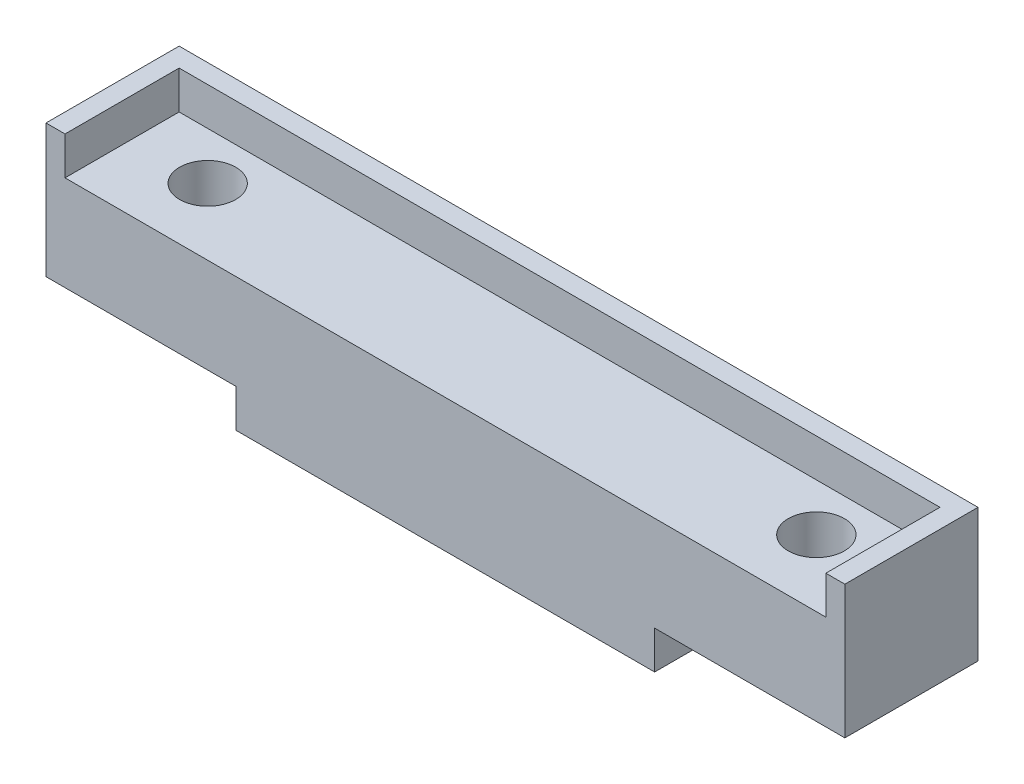
ISO-10303-21;
HEADER;
FILE_DESCRIPTION(('STEP AP214'),'2;1');
FILE_NAME('part.step','',(''),(''),'','','');
FILE_SCHEMA(('AUTOMOTIVE_DESIGN { 1 0 10303 214 1 1 1 1 }'));
ENDSEC;
DATA;
#1=APPLICATION_CONTEXT('core data for automotive mechanical design processes');
#2=APPLICATION_PROTOCOL_DEFINITION('international standard','automotive_design',2000,#1);
#3=PRODUCT_CONTEXT('',#1,'mechanical');
#4=PRODUCT('Part','Part','',(#3));
#5=PRODUCT_RELATED_PRODUCT_CATEGORY('part','',(#4));
#6=PRODUCT_DEFINITION_FORMATION('','',#4);
#7=PRODUCT_DEFINITION_CONTEXT('part definition',#1,'design');
#8=PRODUCT_DEFINITION('design','',#6,#7);
#9=PRODUCT_DEFINITION_SHAPE('','',#8);
#10=(LENGTH_UNIT() NAMED_UNIT(*) SI_UNIT(.MILLI.,.METRE.));
#11=(NAMED_UNIT(*) PLANE_ANGLE_UNIT() SI_UNIT($,.RADIAN.));
#12=(NAMED_UNIT(*) SI_UNIT($,.STERADIAN.) SOLID_ANGLE_UNIT());
#13=UNCERTAINTY_MEASURE_WITH_UNIT(LENGTH_MEASURE(1.E-05),#10,'distance_accuracy_value','');
#14=(GEOMETRIC_REPRESENTATION_CONTEXT(3) GLOBAL_UNCERTAINTY_ASSIGNED_CONTEXT((#13)) GLOBAL_UNIT_ASSIGNED_CONTEXT((#10,
#11,#12)) REPRESENTATION_CONTEXT('',''));
#15=CARTESIAN_POINT('',(0.,0.,0.));
#16=DIRECTION('',(0.,0.,1.));
#17=DIRECTION('',(1.,0.,0.));
#18=AXIS2_PLACEMENT_3D('',#15,#16,#17);
#19=CARTESIAN_POINT('',(0.,0.,0.));
#20=DIRECTION('',(0.,1.,0.));
#21=DIRECTION('',(0.,0.,1.));
#22=AXIS2_PLACEMENT_3D('',#19,#20,#21);
#23=PLANE('',#22);
#24=CARTESIAN_POINT('',(5.,0.,-3.5));
#25=DIRECTION('',(0.,-1.,0.));
#26=DIRECTION('',(0.,0.,-1.));
#27=AXIS2_PLACEMENT_3D('',#24,#25,#26);
#28=CIRCLE('',#27,1.475);
#29=CARTESIAN_POINT('',(5.,0.,-4.975));
#30=VERTEX_POINT('',#29);
#31=EDGE_CURVE('E209',#30,#30,#28,.T.);
#32=ORIENTED_EDGE('',*,*,#31,.F.);
#33=EDGE_LOOP('',(#32));
#34=FACE_BOUND('',#33,.T.);
#35=DIRECTION('',(0.,0.,-1.));
#36=VECTOR('',#35,1.);
#37=CARTESIAN_POINT('',(10.,0.,0.));
#38=LINE('',#37,#36);
#39=CARTESIAN_POINT('',(10.,0.,0.));
#40=VERTEX_POINT('',#39);
#41=CARTESIAN_POINT('',(10.,0.,-7.));
#42=VERTEX_POINT('',#41);
#43=EDGE_CURVE('E60',#40,#42,#38,.T.);
#44=ORIENTED_EDGE('',*,*,#43,.F.);
#45=DIRECTION('',(1.,0.,0.));
#46=VECTOR('',#45,1.);
#47=CARTESIAN_POINT('',(0.,0.,0.));
#48=LINE('',#47,#46);
#49=CARTESIAN_POINT('',(0.,0.,0.));
#50=VERTEX_POINT('',#49);
#51=EDGE_CURVE('E238',#50,#40,#48,.T.);
#52=ORIENTED_EDGE('',*,*,#51,.F.);
#53=DIRECTION('',(0.,0.,1.));
#54=VECTOR('',#53,1.);
#55=CARTESIAN_POINT('',(0.,0.,-7.));
#56=LINE('',#55,#54);
#57=CARTESIAN_POINT('',(0.,0.,-7.));
#58=VERTEX_POINT('',#57);
#59=EDGE_CURVE('E213',#58,#50,#56,.T.);
#60=ORIENTED_EDGE('',*,*,#59,.F.);
#61=DIRECTION('',(-1.,0.,0.));
#62=VECTOR('',#61,1.);
#63=CARTESIAN_POINT('',(0.,0.,-7.));
#64=LINE('',#63,#62);
#65=EDGE_CURVE('E65',#42,#58,#64,.T.);
#66=ORIENTED_EDGE('',*,*,#65,.F.);
#67=EDGE_LOOP('',(#44,#52,#60,#66));
#68=FACE_BOUND('',#67,.T.);
#69=ADVANCED_FACE('F43',(#34,#68),#23,.F.);
#70=CARTESIAN_POINT('',(37.,0.,-3.5));
#71=DIRECTION('',(0.,-1.,0.));
#72=DIRECTION('',(0.,0.,1.));
#73=AXIS2_PLACEMENT_3D('',#70,#71,#72);
#74=CIRCLE('',#73,1.47500000000001);
#75=CARTESIAN_POINT('',(37.,0.,-2.02499999999999));
#76=VERTEX_POINT('',#75);
#77=EDGE_CURVE('E208',#76,#76,#74,.T.);
#78=ORIENTED_EDGE('',*,*,#77,.F.);
#79=EDGE_LOOP('',(#78));
#80=FACE_BOUND('',#79,.T.);
#81=DIRECTION('',(0.,0.,1.));
#82=VECTOR('',#81,1.);
#83=CARTESIAN_POINT('',(32.,0.,0.));
#84=LINE('',#83,#82);
#85=CARTESIAN_POINT('',(32.,0.,-7.));
#86=VERTEX_POINT('',#85);
#87=CARTESIAN_POINT('',(32.,0.,0.));
#88=VERTEX_POINT('',#87);
#89=EDGE_CURVE('E154',#86,#88,#84,.T.);
#90=ORIENTED_EDGE('',*,*,#89,.F.);
#91=CARTESIAN_POINT('',(42.,0.,-7.));
#92=VERTEX_POINT('',#91);
#93=EDGE_CURVE('E222',#92,#86,#64,.T.);
#94=ORIENTED_EDGE('',*,*,#93,.F.);
#95=DIRECTION('',(0.,0.,-1.));
#96=VECTOR('',#95,1.);
#97=CARTESIAN_POINT('',(42.,0.,-7.));
#98=LINE('',#97,#96);
#99=CARTESIAN_POINT('',(42.,0.,0.));
#100=VERTEX_POINT('',#99);
#101=EDGE_CURVE('E241',#100,#92,#98,.T.);
#102=ORIENTED_EDGE('',*,*,#101,.F.);
#103=EDGE_CURVE('E237',#88,#100,#48,.T.);
#104=ORIENTED_EDGE('',*,*,#103,.F.);
#105=EDGE_LOOP('',(#90,#94,#102,#104));
#106=FACE_BOUND('',#105,.T.);
#107=ADVANCED_FACE('F265',(#80,#106),#23,.F.);
#108=CARTESIAN_POINT('',(37.,7.,-3.5));
#109=DIRECTION('',(0.,-1.,0.));
#110=DIRECTION('',(0.,0.,-1.));
#111=AXIS2_PLACEMENT_3D('',#108,#109,#110);
#112=CYLINDRICAL_SURFACE('',#111,1.47500000000001);
#113=ORIENTED_EDGE('',*,*,#77,.T.);
#114=EDGE_LOOP('',(#113));
#115=FACE_BOUND('',#114,.T.);
#116=CARTESIAN_POINT('',(37.,5.,-3.5));
#117=DIRECTION('',(0.,1.,0.));
#118=DIRECTION('',(0.,0.,1.));
#119=AXIS2_PLACEMENT_3D('',#116,#117,#118);
#120=CIRCLE('',#119,1.47500000000001);
#121=CARTESIAN_POINT('',(37.,5.,-2.02499999999999));
#122=VERTEX_POINT('',#121);
#123=EDGE_CURVE('E204',#122,#122,#120,.F.);
#124=ORIENTED_EDGE('',*,*,#123,.F.);
#125=EDGE_LOOP('',(#124));
#126=FACE_BOUND('',#125,.T.);
#127=ADVANCED_FACE('F301',(#115,#126),#112,.F.);
#128=CARTESIAN_POINT('',(5.,7.,-3.5));
#129=DIRECTION('',(0.,-1.,0.));
#130=DIRECTION('',(0.,0.,-1.));
#131=AXIS2_PLACEMENT_3D('',#128,#129,#130);
#132=CYLINDRICAL_SURFACE('',#131,1.475);
#133=ORIENTED_EDGE('',*,*,#31,.T.);
#134=EDGE_LOOP('',(#133));
#135=FACE_BOUND('',#134,.T.);
#136=CARTESIAN_POINT('',(5.,5.,-3.5));
#137=DIRECTION('',(0.,1.,0.));
#138=DIRECTION('',(0.,0.,1.));
#139=AXIS2_PLACEMENT_3D('',#136,#137,#138);
#140=CIRCLE('',#139,1.475);
#141=CARTESIAN_POINT('',(5.,5.,-2.025));
#142=VERTEX_POINT('',#141);
#143=EDGE_CURVE('E47',#142,#142,#140,.F.);
#144=ORIENTED_EDGE('',*,*,#143,.F.);
#145=EDGE_LOOP('',(#144));
#146=FACE_BOUND('',#145,.T.);
#147=ADVANCED_FACE('F299',(#135,#146),#132,.F.);
#148=CARTESIAN_POINT('',(0.,7.,-7.));
#149=DIRECTION('',(1.,0.,0.));
#150=DIRECTION('',(0.,0.,-1.));
#151=AXIS2_PLACEMENT_3D('',#148,#149,#150);
#152=PLANE('',#151);
#153=ORIENTED_EDGE('',*,*,#59,.T.);
#154=DIRECTION('',(0.,-1.,0.));
#155=VECTOR('',#154,1.);
#156=CARTESIAN_POINT('',(0.,7.,0.));
#157=LINE('',#156,#155);
#158=CARTESIAN_POINT('',(0.,7.,0.));
#159=VERTEX_POINT('',#158);
#160=EDGE_CURVE('E11',#159,#50,#157,.T.);
#161=ORIENTED_EDGE('',*,*,#160,.F.);
#162=DIRECTION('',(0.,0.,1.));
#163=VECTOR('',#162,1.);
#164=CARTESIAN_POINT('',(0.,7.,-7.));
#165=LINE('',#164,#163);
#166=CARTESIAN_POINT('',(0.,7.,-7.));
#167=VERTEX_POINT('',#166);
#168=EDGE_CURVE('E217',#167,#159,#165,.T.);
#169=ORIENTED_EDGE('',*,*,#168,.F.);
#170=DIRECTION('',(0.,-1.,0.));
#171=VECTOR('',#170,1.);
#172=CARTESIAN_POINT('',(0.,7.,-7.));
#173=LINE('',#172,#171);
#174=EDGE_CURVE('E233',#167,#58,#173,.T.);
#175=ORIENTED_EDGE('',*,*,#174,.T.);
#176=EDGE_LOOP('',(#153,#161,#169,#175));
#177=FACE_BOUND('',#176,.T.);
#178=ADVANCED_FACE('F45',(#177),#152,.F.);
#179=CARTESIAN_POINT('',(0.,7.,0.));
#180=DIRECTION('',(0.,0.,-1.));
#181=DIRECTION('',(-1.,0.,0.));
#182=AXIS2_PLACEMENT_3D('',#179,#180,#181);
#183=PLANE('',#182);
#184=DIRECTION('',(1.,0.,0.));
#185=VECTOR('',#184,1.);
#186=CARTESIAN_POINT('',(1.,5.,0.));
#187=LINE('',#186,#185);
#188=CARTESIAN_POINT('',(1.,5.,0.));
#189=VERTEX_POINT('',#188);
#190=CARTESIAN_POINT('',(41.,5.,0.));
#191=VERTEX_POINT('',#190);
#192=EDGE_CURVE('E172',#189,#191,#187,.T.);
#193=ORIENTED_EDGE('',*,*,#192,.F.);
#194=DIRECTION('',(0.,1.,0.));
#195=VECTOR('',#194,1.);
#196=CARTESIAN_POINT('',(1.,5.,0.));
#197=LINE('',#196,#195);
#198=CARTESIAN_POINT('',(1.,7.,0.));
#199=VERTEX_POINT('',#198);
#200=EDGE_CURVE('E184',#189,#199,#197,.T.);
#201=ORIENTED_EDGE('',*,*,#200,.T.);
#202=DIRECTION('',(1.,0.,0.));
#203=VECTOR('',#202,1.);
#204=CARTESIAN_POINT('',(0.,7.,0.));
#205=LINE('',#204,#203);
#206=EDGE_CURVE('E223',#159,#199,#205,.T.);
#207=ORIENTED_EDGE('',*,*,#206,.F.);
#208=ORIENTED_EDGE('',*,*,#160,.T.);
#209=ORIENTED_EDGE('',*,*,#51,.T.);
#210=DIRECTION('',(0.,1.,0.));
#211=VECTOR('',#210,1.);
#212=CARTESIAN_POINT('',(10.,-2.,0.));
#213=LINE('',#212,#211);
#214=CARTESIAN_POINT('',(10.,-2.,0.));
#215=VERTEX_POINT('',#214);
#216=EDGE_CURVE('E275',#215,#40,#213,.T.);
#217=ORIENTED_EDGE('',*,*,#216,.F.);
#218=DIRECTION('',(-1.,0.,0.));
#219=VECTOR('',#218,1.);
#220=CARTESIAN_POINT('',(10.,-2.,0.));
#221=LINE('',#220,#219);
#222=CARTESIAN_POINT('',(32.,-2.,0.));
#223=VERTEX_POINT('',#222);
#224=EDGE_CURVE('E149',#223,#215,#221,.T.);
#225=ORIENTED_EDGE('',*,*,#224,.F.);
#226=DIRECTION('',(0.,1.,0.));
#227=VECTOR('',#226,1.);
#228=CARTESIAN_POINT('',(32.,-2.,0.));
#229=LINE('',#228,#227);
#230=EDGE_CURVE('E164',#223,#88,#229,.T.);
#231=ORIENTED_EDGE('',*,*,#230,.T.);
#232=ORIENTED_EDGE('',*,*,#103,.T.);
#233=DIRECTION('',(0.,-1.,0.));
#234=VECTOR('',#233,1.);
#235=CARTESIAN_POINT('',(42.,7.,0.));
#236=LINE('',#235,#234);
#237=CARTESIAN_POINT('',(42.,7.,0.));
#238=VERTEX_POINT('',#237);
#239=EDGE_CURVE('E53',#238,#100,#236,.T.);
#240=ORIENTED_EDGE('',*,*,#239,.F.);
#241=CARTESIAN_POINT('',(41.,7.,0.));
#242=VERTEX_POINT('',#241);
#243=EDGE_CURVE('E221',#242,#238,#205,.T.);
#244=ORIENTED_EDGE('',*,*,#243,.F.);
#245=DIRECTION('',(0.,1.,0.));
#246=VECTOR('',#245,1.);
#247=CARTESIAN_POINT('',(41.,5.,0.));
#248=LINE('',#247,#246);
#249=EDGE_CURVE('E198',#191,#242,#248,.T.);
#250=ORIENTED_EDGE('',*,*,#249,.F.);
#251=EDGE_LOOP('',(#193,#201,#207,#208,#209,#217,#225,#231,#232,#240,#244,#250));
#252=FACE_BOUND('',#251,.T.);
#253=ADVANCED_FACE('F285',(#252),#183,.F.);
#254=CARTESIAN_POINT('',(42.,7.,-7.));
#255=DIRECTION('',(-1.,0.,0.));
#256=DIRECTION('',(0.,0.,1.));
#257=AXIS2_PLACEMENT_3D('',#254,#255,#256);
#258=PLANE('',#257);
#259=ORIENTED_EDGE('',*,*,#101,.T.);
#260=DIRECTION('',(0.,-1.,0.));
#261=VECTOR('',#260,1.);
#262=CARTESIAN_POINT('',(42.,7.,-7.));
#263=LINE('',#262,#261);
#264=CARTESIAN_POINT('',(42.,7.,-7.));
#265=VERTEX_POINT('',#264);
#266=EDGE_CURVE('E249',#265,#92,#263,.T.);
#267=ORIENTED_EDGE('',*,*,#266,.F.);
#268=DIRECTION('',(0.,0.,-1.));
#269=VECTOR('',#268,1.);
#270=CARTESIAN_POINT('',(42.,7.,-7.));
#271=LINE('',#270,#269);
#272=EDGE_CURVE('E227',#238,#265,#271,.T.);
#273=ORIENTED_EDGE('',*,*,#272,.F.);
#274=ORIENTED_EDGE('',*,*,#239,.T.);
#275=EDGE_LOOP('',(#259,#267,#273,#274));
#276=FACE_BOUND('',#275,.T.);
#277=ADVANCED_FACE('F259',(#276),#258,.F.);
#278=CARTESIAN_POINT('',(0.,7.,-7.));
#279=DIRECTION('',(0.,0.,1.));
#280=DIRECTION('',(1.,0.,0.));
#281=AXIS2_PLACEMENT_3D('',#278,#279,#280);
#282=PLANE('',#281);
#283=ORIENTED_EDGE('',*,*,#93,.T.);
#284=DIRECTION('',(0.,1.,0.));
#285=VECTOR('',#284,1.);
#286=CARTESIAN_POINT('',(32.,-2.,-7.));
#287=LINE('',#286,#285);
#288=CARTESIAN_POINT('',(32.,-2.,-7.));
#289=VERTEX_POINT('',#288);
#290=EDGE_CURVE('E139',#289,#86,#287,.T.);
#291=ORIENTED_EDGE('',*,*,#290,.F.);
#292=DIRECTION('',(1.,0.,0.));
#293=VECTOR('',#292,1.);
#294=CARTESIAN_POINT('',(10.,-2.,-7.));
#295=LINE('',#294,#293);
#296=CARTESIAN_POINT('',(10.,-2.,-7.));
#297=VERTEX_POINT('',#296);
#298=EDGE_CURVE('E132',#297,#289,#295,.T.);
#299=ORIENTED_EDGE('',*,*,#298,.F.);
#300=DIRECTION('',(0.,1.,0.));
#301=VECTOR('',#300,1.);
#302=CARTESIAN_POINT('',(10.,-2.,-7.));
#303=LINE('',#302,#301);
#304=EDGE_CURVE('E137',#297,#42,#303,.T.);
#305=ORIENTED_EDGE('',*,*,#304,.T.);
#306=ORIENTED_EDGE('',*,*,#65,.T.);
#307=ORIENTED_EDGE('',*,*,#174,.F.);
#308=DIRECTION('',(-1.,0.,0.));
#309=VECTOR('',#308,1.);
#310=CARTESIAN_POINT('',(0.,7.,-7.));
#311=LINE('',#310,#309);
#312=EDGE_CURVE('E230',#265,#167,#311,.T.);
#313=ORIENTED_EDGE('',*,*,#312,.F.);
#314=ORIENTED_EDGE('',*,*,#266,.T.);
#315=EDGE_LOOP('',(#283,#291,#299,#305,#306,#307,#313,#314));
#316=FACE_BOUND('',#315,.T.);
#317=ADVANCED_FACE('F135',(#316),#282,.F.);
#318=CARTESIAN_POINT('',(0.,7.,0.));
#319=DIRECTION('',(0.,1.,0.));
#320=DIRECTION('',(0.,0.,1.));
#321=AXIS2_PLACEMENT_3D('',#318,#319,#320);
#322=PLANE('',#321);
#323=DIRECTION('',(0.,0.,1.));
#324=VECTOR('',#323,1.);
#325=CARTESIAN_POINT('',(1.,7.,-6.));
#326=LINE('',#325,#324);
#327=CARTESIAN_POINT('',(1.,7.,-6.));
#328=VERTEX_POINT('',#327);
#329=EDGE_CURVE('E158',#328,#199,#326,.T.);
#330=ORIENTED_EDGE('',*,*,#329,.F.);
#331=DIRECTION('',(-1.,0.,0.));
#332=VECTOR('',#331,1.);
#333=CARTESIAN_POINT('',(1.,7.,-6.));
#334=LINE('',#333,#332);
#335=CARTESIAN_POINT('',(41.,7.,-6.));
#336=VERTEX_POINT('',#335);
#337=EDGE_CURVE('E173',#336,#328,#334,.T.);
#338=ORIENTED_EDGE('',*,*,#337,.F.);
#339=DIRECTION('',(0.,0.,-1.));
#340=VECTOR('',#339,1.);
#341=CARTESIAN_POINT('',(41.,7.,-6.));
#342=LINE('',#341,#340);
#343=EDGE_CURVE('E162',#242,#336,#342,.T.);
#344=ORIENTED_EDGE('',*,*,#343,.F.);
#345=ORIENTED_EDGE('',*,*,#243,.T.);
#346=ORIENTED_EDGE('',*,*,#272,.T.);
#347=ORIENTED_EDGE('',*,*,#312,.T.);
#348=ORIENTED_EDGE('',*,*,#168,.T.);
#349=ORIENTED_EDGE('',*,*,#206,.T.);
#350=EDGE_LOOP('',(#330,#338,#344,#345,#346,#347,#348,#349));
#351=FACE_BOUND('',#350,.T.);
#352=ADVANCED_FACE('F321',(#351),#322,.T.);
#353=CARTESIAN_POINT('',(0.,5.,0.));
#354=DIRECTION('',(0.,1.,0.));
#355=DIRECTION('',(0.,0.,1.));
#356=AXIS2_PLACEMENT_3D('',#353,#354,#355);
#357=PLANE('',#356);
#358=DIRECTION('',(0.,0.,1.));
#359=VECTOR('',#358,1.);
#360=CARTESIAN_POINT('',(1.,5.,-6.));
#361=LINE('',#360,#359);
#362=CARTESIAN_POINT('',(1.,5.,-6.));
#363=VERTEX_POINT('',#362);
#364=EDGE_CURVE('E168',#363,#189,#361,.T.);
#365=ORIENTED_EDGE('',*,*,#364,.T.);
#366=ORIENTED_EDGE('',*,*,#192,.T.);
#367=DIRECTION('',(0.,0.,-1.));
#368=VECTOR('',#367,1.);
#369=CARTESIAN_POINT('',(41.,5.,-6.));
#370=LINE('',#369,#368);
#371=CARTESIAN_POINT('',(41.,5.,-6.));
#372=VERTEX_POINT('',#371);
#373=EDGE_CURVE('E177',#191,#372,#370,.T.);
#374=ORIENTED_EDGE('',*,*,#373,.T.);
#375=DIRECTION('',(-1.,0.,0.));
#376=VECTOR('',#375,1.);
#377=CARTESIAN_POINT('',(1.,5.,-6.));
#378=LINE('',#377,#376);
#379=EDGE_CURVE('E181',#372,#363,#378,.T.);
#380=ORIENTED_EDGE('',*,*,#379,.T.);
#381=EDGE_LOOP('',(#365,#366,#374,#380));
#382=FACE_BOUND('',#381,.T.);
#383=ORIENTED_EDGE('',*,*,#143,.T.);
#384=EDGE_LOOP('',(#383));
#385=FACE_BOUND('',#384,.T.);
#386=ORIENTED_EDGE('',*,*,#123,.T.);
#387=EDGE_LOOP('',(#386));
#388=FACE_BOUND('',#387,.T.);
#389=ADVANCED_FACE('F296',(#382,#385,#388),#357,.T.);
#390=CARTESIAN_POINT('',(1.,5.,-6.));
#391=DIRECTION('',(-1.,0.,0.));
#392=DIRECTION('',(0.,0.,1.));
#393=AXIS2_PLACEMENT_3D('',#390,#391,#392);
#394=PLANE('',#393);
#395=ORIENTED_EDGE('',*,*,#329,.T.);
#396=ORIENTED_EDGE('',*,*,#200,.F.);
#397=ORIENTED_EDGE('',*,*,#364,.F.);
#398=DIRECTION('',(0.,1.,0.));
#399=VECTOR('',#398,1.);
#400=CARTESIAN_POINT('',(1.,5.,-6.));
#401=LINE('',#400,#399);
#402=EDGE_CURVE('E192',#363,#328,#401,.T.);
#403=ORIENTED_EDGE('',*,*,#402,.T.);
#404=EDGE_LOOP('',(#395,#396,#397,#403));
#405=FACE_BOUND('',#404,.T.);
#406=ADVANCED_FACE('F353',(#405),#394,.F.);
#407=CARTESIAN_POINT('',(1.,5.,-6.));
#408=DIRECTION('',(0.,0.,-1.));
#409=DIRECTION('',(-1.,0.,0.));
#410=AXIS2_PLACEMENT_3D('',#407,#408,#409);
#411=PLANE('',#410);
#412=ORIENTED_EDGE('',*,*,#337,.T.);
#413=ORIENTED_EDGE('',*,*,#402,.F.);
#414=ORIENTED_EDGE('',*,*,#379,.F.);
#415=DIRECTION('',(0.,1.,0.));
#416=VECTOR('',#415,1.);
#417=CARTESIAN_POINT('',(41.,5.,-6.));
#418=LINE('',#417,#416);
#419=EDGE_CURVE('E195',#372,#336,#418,.T.);
#420=ORIENTED_EDGE('',*,*,#419,.T.);
#421=EDGE_LOOP('',(#412,#413,#414,#420));
#422=FACE_BOUND('',#421,.T.);
#423=ADVANCED_FACE('F361',(#422),#411,.F.);
#424=CARTESIAN_POINT('',(41.,5.,-6.));
#425=DIRECTION('',(1.,0.,0.));
#426=DIRECTION('',(0.,0.,-1.));
#427=AXIS2_PLACEMENT_3D('',#424,#425,#426);
#428=PLANE('',#427);
#429=ORIENTED_EDGE('',*,*,#343,.T.);
#430=ORIENTED_EDGE('',*,*,#419,.F.);
#431=ORIENTED_EDGE('',*,*,#373,.F.);
#432=ORIENTED_EDGE('',*,*,#249,.T.);
#433=EDGE_LOOP('',(#429,#430,#431,#432));
#434=FACE_BOUND('',#433,.T.);
#435=ADVANCED_FACE('F368',(#434),#428,.F.);
#436=CARTESIAN_POINT('',(10.,-2.,0.));
#437=DIRECTION('',(1.,0.,0.));
#438=DIRECTION('',(0.,0.,-1.));
#439=AXIS2_PLACEMENT_3D('',#436,#437,#438);
#440=PLANE('',#439);
#441=ORIENTED_EDGE('',*,*,#43,.T.);
#442=ORIENTED_EDGE('',*,*,#304,.F.);
#443=DIRECTION('',(0.,0.,-1.));
#444=VECTOR('',#443,1.);
#445=CARTESIAN_POINT('',(10.,-2.,0.));
#446=LINE('',#445,#444);
#447=EDGE_CURVE('E144',#215,#297,#446,.T.);
#448=ORIENTED_EDGE('',*,*,#447,.F.);
#449=ORIENTED_EDGE('',*,*,#216,.T.);
#450=EDGE_LOOP('',(#441,#442,#448,#449));
#451=FACE_BOUND('',#450,.T.);
#452=ADVANCED_FACE('F156',(#451),#440,.F.);
#453=CARTESIAN_POINT('',(32.,-2.,0.));
#454=DIRECTION('',(-1.,0.,0.));
#455=DIRECTION('',(0.,0.,1.));
#456=AXIS2_PLACEMENT_3D('',#453,#454,#455);
#457=PLANE('',#456);
#458=ORIENTED_EDGE('',*,*,#89,.T.);
#459=ORIENTED_EDGE('',*,*,#230,.F.);
#460=DIRECTION('',(0.,0.,1.));
#461=VECTOR('',#460,1.);
#462=CARTESIAN_POINT('',(32.,-2.,0.));
#463=LINE('',#462,#461);
#464=EDGE_CURVE('E143',#289,#223,#463,.T.);
#465=ORIENTED_EDGE('',*,*,#464,.F.);
#466=ORIENTED_EDGE('',*,*,#290,.T.);
#467=EDGE_LOOP('',(#458,#459,#465,#466));
#468=FACE_BOUND('',#467,.T.);
#469=ADVANCED_FACE('F269',(#468),#457,.F.);
#470=CARTESIAN_POINT('',(0.,-2.,0.));
#471=DIRECTION('',(0.,-1.,0.));
#472=DIRECTION('',(0.,0.,-1.));
#473=AXIS2_PLACEMENT_3D('',#470,#471,#472);
#474=PLANE('',#473);
#475=ORIENTED_EDGE('',*,*,#447,.T.);
#476=ORIENTED_EDGE('',*,*,#298,.T.);
#477=ORIENTED_EDGE('',*,*,#464,.T.);
#478=ORIENTED_EDGE('',*,*,#224,.T.);
#479=EDGE_LOOP('',(#475,#476,#477,#478));
#480=FACE_BOUND('',#479,.T.);
#481=ADVANCED_FACE('F147',(#480),#474,.T.);
#482=CLOSED_SHELL('',(#69,#107,#127,#147,#178,#253,#277,#317,#352,#389,#406,#423,#435,#452,#469,#481));
#483=MANIFOLD_SOLID_BREP('B2',#482);
#484=ADVANCED_BREP_SHAPE_REPRESENTATION('',(#18,#483),#14);
#485=SHAPE_DEFINITION_REPRESENTATION(#9,#484);
ENDSEC;
END-ISO-10303-21;
